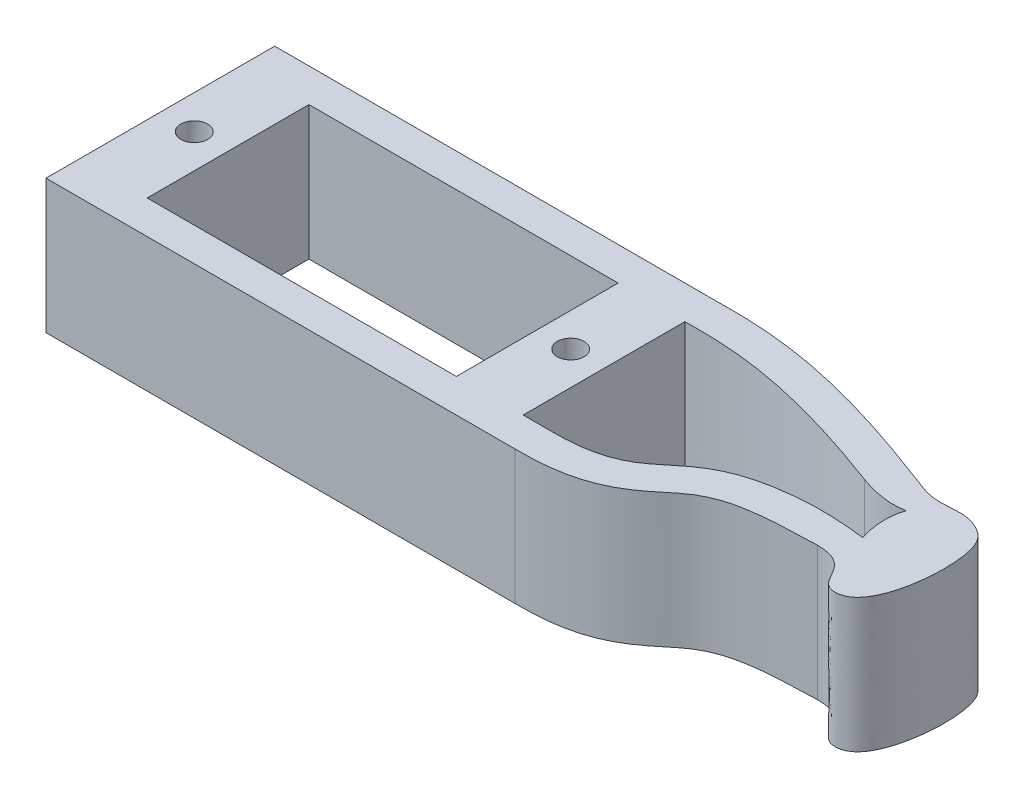
ISO-10303-21;
HEADER;
FILE_DESCRIPTION(('STEP AP214'),'2;1');
FILE_NAME('part.step','',(''),(''),'','','');
FILE_SCHEMA(('AUTOMOTIVE_DESIGN { 1 0 10303 214 1 1 1 1 }'));
ENDSEC;
DATA;
#1=APPLICATION_CONTEXT('core data for automotive mechanical design processes');
#2=APPLICATION_PROTOCOL_DEFINITION('international standard','automotive_design',2000,#1);
#3=PRODUCT_CONTEXT('',#1,'mechanical');
#4=PRODUCT('Part','Part','',(#3));
#5=PRODUCT_RELATED_PRODUCT_CATEGORY('part','',(#4));
#6=PRODUCT_DEFINITION_FORMATION('','',#4);
#7=PRODUCT_DEFINITION_CONTEXT('part definition',#1,'design');
#8=PRODUCT_DEFINITION('design','',#6,#7);
#9=PRODUCT_DEFINITION_SHAPE('','',#8);
#10=(LENGTH_UNIT() NAMED_UNIT(*) SI_UNIT(.MILLI.,.METRE.));
#11=(NAMED_UNIT(*) PLANE_ANGLE_UNIT() SI_UNIT($,.RADIAN.));
#12=(NAMED_UNIT(*) SI_UNIT($,.STERADIAN.) SOLID_ANGLE_UNIT());
#13=UNCERTAINTY_MEASURE_WITH_UNIT(LENGTH_MEASURE(1.E-05),#10,'distance_accuracy_value','');
#14=(GEOMETRIC_REPRESENTATION_CONTEXT(3) GLOBAL_UNCERTAINTY_ASSIGNED_CONTEXT((#13)) GLOBAL_UNIT_ASSIGNED_CONTEXT((#10,
#11,#12)) REPRESENTATION_CONTEXT('',''));
#15=CARTESIAN_POINT('',(0.,0.,0.));
#16=DIRECTION('',(0.,0.,1.));
#17=DIRECTION('',(1.,0.,0.));
#18=AXIS2_PLACEMENT_3D('',#15,#16,#17);
#19=CARTESIAN_POINT('',(38.8180795672071,10.,11.4476657768561));
#20=DIRECTION('',(0.,-1.,0.));
#21=DIRECTION('',(0.,0.,-1.));
#22=AXIS2_PLACEMENT_3D('',#19,#20,#21);
#23=PLANE('',#22);
#24=DIRECTION('',(-1.,0.,0.));
#25=VECTOR('',#24,1.);
#26=CARTESIAN_POINT('',(0.,10.,0.));
#27=LINE('',#26,#25);
#28=CARTESIAN_POINT('',(23.1,10.,0.));
#29=VERTEX_POINT('',#28);
#30=CARTESIAN_POINT('',(0.,10.,0.));
#31=VERTEX_POINT('',#30);
#32=EDGE_CURVE('E601',#29,#31,#27,.T.);
#33=ORIENTED_EDGE('',*,*,#32,.F.);
#34=DIRECTION('',(0.,0.,-1.));
#35=VECTOR('',#34,1.);
#36=CARTESIAN_POINT('',(23.1,10.,12.0851651354171));
#37=LINE('',#36,#35);
#38=CARTESIAN_POINT('',(23.1,10.,12.0851651354171));
#39=VERTEX_POINT('',#38);
#40=EDGE_CURVE('E612',#39,#29,#37,.T.);
#41=ORIENTED_EDGE('',*,*,#40,.F.);
#42=DIRECTION('',(1.,0.,0.));
#43=VECTOR('',#42,1.);
#44=CARTESIAN_POINT('',(0.,10.,12.0851651354171));
#45=LINE('',#44,#43);
#46=CARTESIAN_POINT('',(0.,10.,12.0851651354171));
#47=VERTEX_POINT('',#46);
#48=EDGE_CURVE('E608',#47,#39,#45,.T.);
#49=ORIENTED_EDGE('',*,*,#48,.F.);
#50=DIRECTION('',(0.,0.,1.));
#51=VECTOR('',#50,1.);
#52=CARTESIAN_POINT('',(0.,10.,0.));
#53=LINE('',#52,#51);
#54=EDGE_CURVE('E604',#31,#47,#53,.T.);
#55=ORIENTED_EDGE('',*,*,#54,.F.);
#56=EDGE_LOOP('',(#33,#41,#49,#55));
#57=FACE_BOUND('',#56,.T.);
#58=DIRECTION('',(-1.,0.,0.));
#59=VECTOR('',#58,1.);
#60=CARTESIAN_POINT('',(-2.5,10.,-2.5));
#61=LINE('',#60,#59);
#62=CARTESIAN_POINT('',(28.0710705338312,10.,-2.5));
#63=VERTEX_POINT('',#62);
#64=CARTESIAN_POINT('',(-5.06162779095857,10.,-2.5));
#65=VERTEX_POINT('',#64);
#66=EDGE_CURVE('E303',#63,#65,#61,.T.);
#67=ORIENTED_EDGE('',*,*,#66,.T.);
#68=DIRECTION('',(0.,0.,1.));
#69=VECTOR('',#68,1.);
#70=CARTESIAN_POINT('',(-5.06162779095857,10.,-2.5));
#71=LINE('',#70,#69);
#72=CARTESIAN_POINT('',(-5.06162779095857,10.,14.5851651354171));
#73=VERTEX_POINT('',#72);
#74=EDGE_CURVE('E327',#65,#73,#71,.T.);
#75=ORIENTED_EDGE('',*,*,#74,.T.);
#76=DIRECTION('',(1.,0.,0.));
#77=VECTOR('',#76,1.);
#78=CARTESIAN_POINT('',(-5.06162779095857,10.,14.5851651354171));
#79=LINE('',#78,#77);
#80=CARTESIAN_POINT('',(29.9653088290822,10.,14.5851651354171));
#81=VERTEX_POINT('',#80);
#82=EDGE_CURVE('E325',#73,#81,#79,.T.);
#83=ORIENTED_EDGE('',*,*,#82,.T.);
#84=CARTESIAN_POINT('',(29.9653088290822,10.,14.5851651354171));
#85=CARTESIAN_POINT('',(30.265918726977,10.,14.5898273179801));
#86=CARTESIAN_POINT('',(30.8820735190505,10.,14.5874895720548));
#87=CARTESIAN_POINT('',(31.9957077565243,10.,14.5340669308558));
#88=CARTESIAN_POINT('',(33.2670048927527,10.,14.3780541720264));
#89=CARTESIAN_POINT('',(34.6081596512348,10.,14.0479264842163));
#90=CARTESIAN_POINT('',(36.1765576739849,10.,13.4304805226767));
#91=CARTESIAN_POINT('',(37.6743714620708,10.,12.4202539536069));
#92=CARTESIAN_POINT('',(38.8525565692643,10.,11.3916870089746));
#93=CARTESIAN_POINT('',(39.8238796641146,10.,10.6989926716314));
#94=CARTESIAN_POINT('',(40.9308835767077,10.,10.2053361425746));
#95=CARTESIAN_POINT('',(42.3284062711518,10.,9.86988371824036));
#96=CARTESIAN_POINT('',(43.4554784758485,10.,9.71129964165567));
#97=CARTESIAN_POINT('',(44.4120672135985,10.,9.63734112365588));
#98=CARTESIAN_POINT('',(44.9894319310272,10.,9.60878294824058));
#99=CARTESIAN_POINT('',(45.9980119648731,10.,9.5722300676556));
#100=CARTESIAN_POINT('',(46.8281698923848,10.,9.53956708288117));
#101=CARTESIAN_POINT('',(47.4956003732826,10.,9.51414141536678));
#102=B_SPLINE_CURVE_WITH_KNOTS('',3,(#84,#85,#86,#87,#88,#89,#90,#91,#92,#93,#94,#95,#96,#97,
#98,#99,#100,#101),.UNSPECIFIED.,.F.,.F.,(4,1,1,1,1,1,1,1,1,1,1,1,1,1,1,4),
(0.000758631010886912,0.0345191574764747,0.0682796839420625,0.135800736873238,0.203321789804413,
0.270842842735589,0.405884948597939,0.54092705446029,0.675969160322641,0.811011266184992,
0.878532319116167,0.946053372047343,0.979813898512931,0.996694161745724,1.01357442497852,
1.08109547790969),.UNSPECIFIED.);
#103=CARTESIAN_POINT('',(47.4956003732825,10.,9.51414141536678));
#104=VERTEX_POINT('',#103);
#105=EDGE_CURVE('E347',#81,#104,#102,.T.);
#106=ORIENTED_EDGE('',*,*,#105,.T.);
#107=CARTESIAN_POINT('',(47.4956003732825,10.,9.51414141536678));
#108=CARTESIAN_POINT('',(50.1829843049378,10.,9.48052862720533));
#109=CARTESIAN_POINT('',(49.5532829579756,10.,12.1452177729383));
#110=CARTESIAN_POINT('',(53.7490053885279,10.,11.6341926827288));
#111=CARTESIAN_POINT('',(54.2885740527018,10.,3.8385013757902));
#112=CARTESIAN_POINT('',(50.7289274546855,10.,1.29908628709451));
#113=CARTESIAN_POINT('',(49.7783681591544,10.,2.70174191928724));
#114=CARTESIAN_POINT('',(47.4956003732826,10.,1.7573806933215));
#115=B_SPLINE_CURVE_WITH_KNOTS('',3,(#107,#108,#109,#110,#111,#112,#113,#114),.UNSPECIFIED.,.F.,
.F.,(4,1,1,1,1,4),(0.,0.206124452316591,0.260502327976179,0.512303597860358,0.589400880936293,
1.),.UNSPECIFIED.);
#116=CARTESIAN_POINT('',(47.4956003732826,10.,1.7573806933215));
#117=VERTEX_POINT('',#116);
#118=EDGE_CURVE('E260',#104,#117,#115,.T.);
#119=ORIENTED_EDGE('',*,*,#118,.T.);
#120=CARTESIAN_POINT('',(47.4956003732826,10.,1.7573806933215));
#121=CARTESIAN_POINT('',(46.325704030634,10.,1.31962826614976));
#122=CARTESIAN_POINT('',(43.8950497031658,10.,0.404736284182584));
#123=CARTESIAN_POINT('',(40.7526738149611,10.,-0.61929276858225));
#124=CARTESIAN_POINT('',(37.9742589079886,10.,-1.38863344719493));
#125=CARTESIAN_POINT('',(34.7092860581728,10.,-2.10364630059871));
#126=CARTESIAN_POINT('',(31.9844337731172,10.,-2.42933803906978));
#127=CARTESIAN_POINT('',(29.9391455938386,10.,-2.50469427808166));
#128=CARTESIAN_POINT('',(28.8455167678502,10.,-2.51018952961797));
#129=CARTESIAN_POINT('',(28.3319692226393,10.,-2.50433770622464));
#130=CARTESIAN_POINT('',(28.0710705338312,10.,-2.5));
#131=B_SPLINE_CURVE_WITH_KNOTS('',3,(#120,#121,#122,#123,#124,#125,#126,#127,#128,#129,#130),
.UNSPECIFIED.,.F.,.F.,(4,1,1,1,1,1,1,1,4),(0.143652209632504,0.257209336272867,
0.370766462913229,0.484323589553591,0.597880716193954,0.824994969474678,0.938552096115041,
0.995330659435222,1.0521092227554),.UNSPECIFIED.);
#132=EDGE_CURVE('E252',#117,#63,#131,.T.);
#133=ORIENTED_EDGE('',*,*,#132,.T.);
#134=EDGE_LOOP('',(#67,#75,#83,#106,#119,#133));
#135=FACE_BOUND('',#134,.T.);
#136=CARTESIAN_POINT('',(29.9852161632243,10.,12.0851651354171));
#137=CARTESIAN_POINT('',(38.2810747079521,10.,12.2209443605822));
#138=CARTESIAN_POINT('',(35.1108244119517,10.,7.48412429725424));
#139=CARTESIAN_POINT('',(44.9956003732826,10.,7.10756518849293));
#140=B_SPLINE_CURVE_WITH_KNOTS('',3,(#136,#137,#138,#139),.UNSPECIFIED.,.F.,.F.,(4,4),(0.,1.),.UNSPECIFIED.);
#141=CARTESIAN_POINT('',(29.9852161632243,10.,12.0851651354171));
#142=VERTEX_POINT('',#141);
#143=CARTESIAN_POINT('',(44.9956003732826,10.,7.10756518849293));
#144=VERTEX_POINT('',#143);
#145=EDGE_CURVE('E165',#142,#144,#140,.T.);
#146=ORIENTED_EDGE('',*,*,#145,.F.);
#147=DIRECTION('',(1.,0.,0.));
#148=VECTOR('',#147,1.);
#149=CARTESIAN_POINT('',(28.0920322760738,10.,12.0851651354171));
#150=LINE('',#149,#148);
#151=CARTESIAN_POINT('',(28.0920322760738,10.,12.0851651354171));
#152=VERTEX_POINT('',#151);
#153=EDGE_CURVE('E534',#152,#142,#150,.T.);
#154=ORIENTED_EDGE('',*,*,#153,.F.);
#155=DIRECTION('',(0.,0.,1.));
#156=VECTOR('',#155,1.);
#157=CARTESIAN_POINT('',(28.0920322760738,10.,0.));
#158=LINE('',#157,#156);
#159=CARTESIAN_POINT('',(28.0920322760738,10.,0.));
#160=VERTEX_POINT('',#159);
#161=EDGE_CURVE('E525',#160,#152,#158,.T.);
#162=ORIENTED_EDGE('',*,*,#161,.F.);
#163=CARTESIAN_POINT('',(44.9956003732826,10.,3.49121189900544));
#164=CARTESIAN_POINT('',(36.0837642694881,10.,0.156576390905116));
#165=CARTESIAN_POINT('',(31.8190342239397,10.,-0.0630491739583388));
#166=CARTESIAN_POINT('',(28.0920322760738,10.,0.));
#167=B_SPLINE_CURVE_WITH_KNOTS('',3,(#163,#164,#165,#166),.UNSPECIFIED.,.F.,.F.,(4,4),
(0.142072163734168,1.),.UNSPECIFIED.);
#168=CARTESIAN_POINT('',(44.9956003732826,10.,3.49121189900544));
#169=VERTEX_POINT('',#168);
#170=EDGE_CURVE('E519',#169,#160,#167,.T.);
#171=ORIENTED_EDGE('',*,*,#170,.F.);
#172=CARTESIAN_POINT('',(48.5973126252053,10.,3.96311649777559));
#173=CARTESIAN_POINT('',(47.1194473607959,10.,4.2650860076599));
#174=CARTESIAN_POINT('',(44.9956003732826,10.,3.49121189900543));
#175=B_SPLINE_CURVE_WITH_KNOTS('',2,(#172,#173,#174),.UNSPECIFIED.,.F.,.F.,(3,3),(0.,1.),.UNSPECIFIED.);
#176=CARTESIAN_POINT('',(48.5973126252053,10.,3.96311649777559));
#177=VERTEX_POINT('',#176);
#178=EDGE_CURVE('E193',#177,#169,#175,.T.);
#179=ORIENTED_EDGE('',*,*,#178,.F.);
#180=CARTESIAN_POINT('',(48.7103270151303,10.,7.32576645158645));
#181=CARTESIAN_POINT('',(48.3452536132831,10.,6.19757171358135));
#182=CARTESIAN_POINT('',(48.2430866216302,10.,5.00954180630637));
#183=CARTESIAN_POINT('',(48.5973126252053,10.,3.96311649777559));
#184=B_SPLINE_CURVE_WITH_KNOTS('',3,(#180,#181,#182,#183),.UNSPECIFIED.,.F.,.F.,(4,4),(0.,1.),.UNSPECIFIED.);
#185=CARTESIAN_POINT('',(48.7103270151303,10.,7.32576645158645));
#186=VERTEX_POINT('',#185);
#187=EDGE_CURVE('E189',#186,#177,#184,.T.);
#188=ORIENTED_EDGE('',*,*,#187,.F.);
#189=CARTESIAN_POINT('',(44.9956003732826,10.,7.10756518849293));
#190=CARTESIAN_POINT('',(46.5345408888566,10.,7.08391660517014));
#191=CARTESIAN_POINT('',(48.7103270151303,10.,7.32576645158645));
#192=B_SPLINE_CURVE_WITH_KNOTS('',2,(#189,#190,#191),.UNSPECIFIED.,.F.,.F.,(3,3),(0.,1.),.UNSPECIFIED.);
#193=EDGE_CURVE('E174',#144,#186,#192,.T.);
#194=ORIENTED_EDGE('',*,*,#193,.F.);
#195=EDGE_LOOP('',(#146,#154,#162,#171,#179,#188,#194));
#196=FACE_BOUND('',#195,.T.);
#197=CARTESIAN_POINT('',(-2.53081389547928,10.,6.04258256770856));
#198=DIRECTION('',(0.,1.,0.));
#199=DIRECTION('',(0.,0.,1.));
#200=AXIS2_PLACEMENT_3D('',#197,#198,#199);
#201=CIRCLE('',#200,1.);
#202=CARTESIAN_POINT('',(-2.53081389547928,10.,7.04258256770856));
#203=VERTEX_POINT('',#202);
#204=EDGE_CURVE('E541',#203,#203,#201,.T.);
#205=ORIENTED_EDGE('',*,*,#204,.F.);
#206=EDGE_LOOP('',(#205));
#207=FACE_BOUND('',#206,.T.);
#208=CARTESIAN_POINT('',(25.6000010172625,10.,6.04254892676587));
#209=DIRECTION('',(0.,1.,0.));
#210=DIRECTION('',(0.,0.,1.));
#211=AXIS2_PLACEMENT_3D('',#208,#209,#210);
#212=CIRCLE('',#211,1.);
#213=CARTESIAN_POINT('',(25.6000010172625,10.,7.04254892676587));
#214=VERTEX_POINT('',#213);
#215=EDGE_CURVE('E661',#214,#214,#212,.T.);
#216=ORIENTED_EDGE('',*,*,#215,.F.);
#217=EDGE_LOOP('',(#216));
#218=FACE_BOUND('',#217,.T.);
#219=ADVANCED_FACE('F45',(#57,#135,#196,#207,#218),#23,.F.);
#220=CARTESIAN_POINT('',(38.8180795672071,0.,11.4476657768561));
#221=DIRECTION('',(0.,-1.,0.));
#222=DIRECTION('',(0.,0.,-1.));
#223=AXIS2_PLACEMENT_3D('',#220,#221,#222);
#224=PLANE('',#223);
#225=CARTESIAN_POINT('',(-2.53081389547928,0.,6.04258256770856));
#226=DIRECTION('',(0.,1.,0.));
#227=DIRECTION('',(0.,0.,1.));
#228=AXIS2_PLACEMENT_3D('',#225,#226,#227);
#229=CIRCLE('',#228,1.);
#230=CARTESIAN_POINT('',(-2.53081389547928,0.,7.04258256770856));
#231=VERTEX_POINT('',#230);
#232=EDGE_CURVE('E664',#231,#231,#229,.T.);
#233=ORIENTED_EDGE('',*,*,#232,.T.);
#234=EDGE_LOOP('',(#233));
#235=FACE_BOUND('',#234,.T.);
#236=DIRECTION('',(0.,0.,1.));
#237=VECTOR('',#236,1.);
#238=CARTESIAN_POINT('',(-5.06162779095857,0.,-2.5));
#239=LINE('',#238,#237);
#240=CARTESIAN_POINT('',(-5.06162779095857,0.,-2.5));
#241=VERTEX_POINT('',#240);
#242=CARTESIAN_POINT('',(-5.06162779095857,0.,14.5851651354171));
#243=VERTEX_POINT('',#242);
#244=EDGE_CURVE('E265',#241,#243,#239,.T.);
#245=ORIENTED_EDGE('',*,*,#244,.F.);
#246=DIRECTION('',(-1.,0.,0.));
#247=VECTOR('',#246,1.);
#248=CARTESIAN_POINT('',(-2.5,0.,-2.5));
#249=LINE('',#248,#247);
#250=CARTESIAN_POINT('',(28.0710705338312,0.,-2.5));
#251=VERTEX_POINT('',#250);
#252=EDGE_CURVE('E297',#251,#241,#249,.T.);
#253=ORIENTED_EDGE('',*,*,#252,.F.);
#254=CARTESIAN_POINT('',(47.4956003732826,0.,1.7573806933215));
#255=CARTESIAN_POINT('',(46.325704030634,0.,1.31962826614976));
#256=CARTESIAN_POINT('',(43.8950497031658,0.,0.404736284182584));
#257=CARTESIAN_POINT('',(40.7526738149611,0.,-0.61929276858225));
#258=CARTESIAN_POINT('',(37.9742589079886,0.,-1.38863344719493));
#259=CARTESIAN_POINT('',(34.7092860581728,0.,-2.10364630059871));
#260=CARTESIAN_POINT('',(31.9844337731172,0.,-2.42933803906978));
#261=CARTESIAN_POINT('',(29.9391455938386,0.,-2.50469427808166));
#262=CARTESIAN_POINT('',(28.8455167678502,0.,-2.51018952961797));
#263=CARTESIAN_POINT('',(28.3319692226393,0.,-2.50433770622464));
#264=CARTESIAN_POINT('',(28.0710705338312,0.,-2.5));
#265=B_SPLINE_CURVE_WITH_KNOTS('',3,(#254,#255,#256,#257,#258,#259,#260,#261,#262,#263,#264),
.UNSPECIFIED.,.F.,.F.,(4,1,1,1,1,1,1,1,4),(0.143652209632504,0.257209336272867,
0.370766462913229,0.484323589553591,0.597880716193954,0.824994969474678,0.938552096115041,
0.995330659435222,1.0521092227554),.UNSPECIFIED.);
#266=CARTESIAN_POINT('',(47.4956003732826,0.,1.7573806933215));
#267=VERTEX_POINT('',#266);
#268=EDGE_CURVE('E289',#267,#251,#265,.T.);
#269=ORIENTED_EDGE('',*,*,#268,.F.);
#270=CARTESIAN_POINT('',(47.4956003732825,0.,9.51414141536678));
#271=CARTESIAN_POINT('',(50.1829843049378,0.,9.48052862720533));
#272=CARTESIAN_POINT('',(49.5532829579756,0.,12.1452177729383));
#273=CARTESIAN_POINT('',(53.7490053885279,0.,11.6341926827288));
#274=CARTESIAN_POINT('',(54.2885740527018,0.,3.8385013757902));
#275=CARTESIAN_POINT('',(50.7289274546855,0.,1.29908628709451));
#276=CARTESIAN_POINT('',(49.7783681591544,0.,2.70174191928724));
#277=CARTESIAN_POINT('',(47.4956003732826,0.,1.7573806933215));
#278=B_SPLINE_CURVE_WITH_KNOTS('',3,(#270,#271,#272,#273,#274,#275,#276,#277),.UNSPECIFIED.,.F.,
.F.,(4,1,1,1,1,4),(0.,0.206124452316591,0.260502327976179,0.512303597860358,0.589400880936293,
1.),.UNSPECIFIED.);
#279=CARTESIAN_POINT('',(47.4956003732825,0.,9.51414141536678));
#280=VERTEX_POINT('',#279);
#281=EDGE_CURVE('E281',#280,#267,#278,.T.);
#282=ORIENTED_EDGE('',*,*,#281,.F.);
#283=CARTESIAN_POINT('',(29.9653088290822,0.,14.5851651354171));
#284=CARTESIAN_POINT('',(30.265918726977,0.,14.5898273179801));
#285=CARTESIAN_POINT('',(30.8820735190505,0.,14.5874895720548));
#286=CARTESIAN_POINT('',(31.9957077565243,0.,14.5340669308558));
#287=CARTESIAN_POINT('',(33.2670048927527,0.,14.3780541720264));
#288=CARTESIAN_POINT('',(34.6081596512348,0.,14.0479264842163));
#289=CARTESIAN_POINT('',(36.1765576739849,0.,13.4304805226767));
#290=CARTESIAN_POINT('',(37.6743714620708,0.,12.4202539536069));
#291=CARTESIAN_POINT('',(38.8525565692643,0.,11.3916870089746));
#292=CARTESIAN_POINT('',(39.8238796641146,0.,10.6989926716314));
#293=CARTESIAN_POINT('',(40.9308835767077,0.,10.2053361425746));
#294=CARTESIAN_POINT('',(42.3284062711518,0.,9.86988371824036));
#295=CARTESIAN_POINT('',(43.4554784758485,0.,9.71129964165567));
#296=CARTESIAN_POINT('',(44.4120672135985,0.,9.63734112365588));
#297=CARTESIAN_POINT('',(44.9894319310272,0.,9.60878294824058));
#298=CARTESIAN_POINT('',(45.9980119648731,0.,9.5722300676556));
#299=CARTESIAN_POINT('',(46.8281698923848,0.,9.53956708288117));
#300=CARTESIAN_POINT('',(47.4956003732826,0.,9.51414141536678));
#301=B_SPLINE_CURVE_WITH_KNOTS('',3,(#283,#284,#285,#286,#287,#288,#289,#290,#291,#292,#293,
#294,#295,#296,#297,#298,#299,#300),.UNSPECIFIED.,.F.,.F.,(4,1,1,1,1,1,1,1,1,1,1,1,1,1,1,4),
(0.000758631010886912,0.0345191574764747,0.0682796839420625,0.135800736873238,0.203321789804413,
0.270842842735589,0.405884948597939,0.54092705446029,0.675969160322641,0.811011266184992,
0.878532319116167,0.946053372047343,0.979813898512931,0.996694161745724,1.01357442497852,
1.08109547790969),.UNSPECIFIED.);
#302=CARTESIAN_POINT('',(29.9653088290822,0.,14.5851651354171));
#303=VERTEX_POINT('',#302);
#304=EDGE_CURVE('E276',#303,#280,#301,.T.);
#305=ORIENTED_EDGE('',*,*,#304,.F.);
#306=DIRECTION('',(1.,0.,0.));
#307=VECTOR('',#306,1.);
#308=CARTESIAN_POINT('',(-2.5,0.,14.5851651354171));
#309=LINE('',#308,#307);
#310=EDGE_CURVE('E272',#243,#303,#309,.T.);
#311=ORIENTED_EDGE('',*,*,#310,.F.);
#312=EDGE_LOOP('',(#245,#253,#269,#282,#305,#311));
#313=FACE_BOUND('',#312,.T.);
#314=DIRECTION('',(0.,0.,-1.));
#315=VECTOR('',#314,1.);
#316=CARTESIAN_POINT('',(23.1,0.,12.0851651354171));
#317=LINE('',#316,#315);
#318=CARTESIAN_POINT('',(23.1,0.,12.0851651354171));
#319=VERTEX_POINT('',#318);
#320=CARTESIAN_POINT('',(23.1,0.,0.));
#321=VERTEX_POINT('',#320);
#322=EDGE_CURVE('E605',#319,#321,#317,.T.);
#323=ORIENTED_EDGE('',*,*,#322,.T.);
#324=DIRECTION('',(-1.,0.,0.));
#325=VECTOR('',#324,1.);
#326=CARTESIAN_POINT('',(0.,0.,0.));
#327=LINE('',#326,#325);
#328=CARTESIAN_POINT('',(0.,0.,0.));
#329=VERTEX_POINT('',#328);
#330=EDGE_CURVE('E183',#321,#329,#327,.T.);
#331=ORIENTED_EDGE('',*,*,#330,.T.);
#332=DIRECTION('',(0.,0.,1.));
#333=VECTOR('',#332,1.);
#334=CARTESIAN_POINT('',(0.,0.,0.));
#335=LINE('',#334,#333);
#336=CARTESIAN_POINT('',(0.,0.,12.0851651354171));
#337=VERTEX_POINT('',#336);
#338=EDGE_CURVE('E619',#329,#337,#335,.T.);
#339=ORIENTED_EDGE('',*,*,#338,.T.);
#340=DIRECTION('',(1.,0.,0.));
#341=VECTOR('',#340,1.);
#342=CARTESIAN_POINT('',(0.,0.,12.0851651354171));
#343=LINE('',#342,#341);
#344=EDGE_CURVE('E623',#337,#319,#343,.T.);
#345=ORIENTED_EDGE('',*,*,#344,.T.);
#346=EDGE_LOOP('',(#323,#331,#339,#345));
#347=FACE_BOUND('',#346,.T.);
#348=DIRECTION('',(1.,0.,0.));
#349=VECTOR('',#348,1.);
#350=CARTESIAN_POINT('',(28.0920322760738,0.,12.0851651354171));
#351=LINE('',#350,#349);
#352=CARTESIAN_POINT('',(28.0920322760738,0.,12.0851651354171));
#353=VERTEX_POINT('',#352);
#354=CARTESIAN_POINT('',(29.9852161632243,0.,12.0851651354171));
#355=VERTEX_POINT('',#354);
#356=EDGE_CURVE('E175',#353,#355,#351,.T.);
#357=ORIENTED_EDGE('',*,*,#356,.T.);
#358=CARTESIAN_POINT('',(29.9852161632243,0.,12.0851651354171));
#359=CARTESIAN_POINT('',(38.2810747079521,0.,12.2209443605822));
#360=CARTESIAN_POINT('',(35.1108244119517,0.,7.48412429725424));
#361=CARTESIAN_POINT('',(44.9956003732826,0.,7.10756518849293));
#362=B_SPLINE_CURVE_WITH_KNOTS('',3,(#358,#359,#360,#361),.UNSPECIFIED.,.F.,.F.,(4,4),(0.,1.),.UNSPECIFIED.);
#363=CARTESIAN_POINT('',(44.9956003732826,0.,7.10756518849293));
#364=VERTEX_POINT('',#363);
#365=EDGE_CURVE('E69',#355,#364,#362,.T.);
#366=ORIENTED_EDGE('',*,*,#365,.T.);
#367=CARTESIAN_POINT('',(44.9956003732826,0.,7.10756518849293));
#368=CARTESIAN_POINT('',(46.5345408888566,0.,7.08391660517014));
#369=CARTESIAN_POINT('',(48.7103270151303,0.,7.32576645158645));
#370=B_SPLINE_CURVE_WITH_KNOTS('',2,(#367,#368,#369),.UNSPECIFIED.,.F.,.F.,(3,3),(0.,1.),.UNSPECIFIED.);
#371=CARTESIAN_POINT('',(48.7103270151303,0.,7.32576645158645));
#372=VERTEX_POINT('',#371);
#373=EDGE_CURVE('E181',#364,#372,#370,.T.);
#374=ORIENTED_EDGE('',*,*,#373,.T.);
#375=CARTESIAN_POINT('',(48.7103270151303,0.,7.32576645158645));
#376=CARTESIAN_POINT('',(48.3452536132831,0.,6.19757171358135));
#377=CARTESIAN_POINT('',(48.2430866216302,0.,5.00954180630637));
#378=CARTESIAN_POINT('',(48.5973126252053,0.,3.96311649777559));
#379=B_SPLINE_CURVE_WITH_KNOTS('',3,(#375,#376,#377,#378),.UNSPECIFIED.,.F.,.F.,(4,4),(0.,1.),.UNSPECIFIED.);
#380=CARTESIAN_POINT('',(48.5973126252053,0.,3.96311649777559));
#381=VERTEX_POINT('',#380);
#382=EDGE_CURVE('E549',#372,#381,#379,.T.);
#383=ORIENTED_EDGE('',*,*,#382,.T.);
#384=CARTESIAN_POINT('',(48.5973126252053,0.,3.96311649777559));
#385=CARTESIAN_POINT('',(47.1194473607959,0.,4.2650860076599));
#386=CARTESIAN_POINT('',(44.9956003732826,0.,3.49121189900543));
#387=B_SPLINE_CURVE_WITH_KNOTS('',2,(#384,#385,#386),.UNSPECIFIED.,.F.,.F.,(3,3),(0.,1.),.UNSPECIFIED.);
#388=CARTESIAN_POINT('',(44.9956003732826,0.,3.49121189900544));
#389=VERTEX_POINT('',#388);
#390=EDGE_CURVE('E558',#381,#389,#387,.T.);
#391=ORIENTED_EDGE('',*,*,#390,.T.);
#392=CARTESIAN_POINT('',(44.9956003732826,0.,3.49121189900544));
#393=CARTESIAN_POINT('',(36.0837642694881,0.,0.156576390905116));
#394=CARTESIAN_POINT('',(31.8190342239397,0.,-0.0630491739583388));
#395=CARTESIAN_POINT('',(28.0920322760738,0.,0.));
#396=B_SPLINE_CURVE_WITH_KNOTS('',3,(#392,#393,#394,#395),.UNSPECIFIED.,.F.,.F.,(4,4),
(0.142072163734168,1.),.UNSPECIFIED.);
#397=CARTESIAN_POINT('',(28.0920322760738,0.,0.));
#398=VERTEX_POINT('',#397);
#399=EDGE_CURVE('E567',#389,#398,#396,.T.);
#400=ORIENTED_EDGE('',*,*,#399,.T.);
#401=DIRECTION('',(0.,0.,1.));
#402=VECTOR('',#401,1.);
#403=CARTESIAN_POINT('',(28.0920322760738,0.,0.));
#404=LINE('',#403,#402);
#405=EDGE_CURVE('E576',#398,#353,#404,.T.);
#406=ORIENTED_EDGE('',*,*,#405,.T.);
#407=EDGE_LOOP('',(#357,#366,#374,#383,#391,#400,#406));
#408=FACE_BOUND('',#407,.T.);
#409=CARTESIAN_POINT('',(25.6000010172625,0.,6.04254892676587));
#410=DIRECTION('',(0.,1.,0.));
#411=DIRECTION('',(0.,0.,1.));
#412=AXIS2_PLACEMENT_3D('',#409,#410,#411);
#413=CIRCLE('',#412,1.);
#414=CARTESIAN_POINT('',(25.6000010172625,0.,7.04254892676587));
#415=VERTEX_POINT('',#414);
#416=EDGE_CURVE('E659',#415,#415,#413,.T.);
#417=ORIENTED_EDGE('',*,*,#416,.T.);
#418=EDGE_LOOP('',(#417));
#419=FACE_BOUND('',#418,.T.);
#420=ADVANCED_FACE('F236',(#235,#313,#347,#408,#419),#224,.T.);
#421=CARTESIAN_POINT('',(-5.06162779095857,10.,-2.5));
#422=DIRECTION('',(1.,0.,0.));
#423=DIRECTION('',(0.,0.,-1.));
#424=AXIS2_PLACEMENT_3D('',#421,#422,#423);
#425=PLANE('',#424);
#426=ORIENTED_EDGE('',*,*,#244,.T.);
#427=DIRECTION('',(0.,-1.,0.));
#428=VECTOR('',#427,1.);
#429=CARTESIAN_POINT('',(-5.06162779095857,10.,14.5851651354171));
#430=LINE('',#429,#428);
#431=EDGE_CURVE('E54',#73,#243,#430,.T.);
#432=ORIENTED_EDGE('',*,*,#431,.F.);
#433=ORIENTED_EDGE('',*,*,#74,.F.);
#434=DIRECTION('',(0.,-1.,0.));
#435=VECTOR('',#434,1.);
#436=CARTESIAN_POINT('',(-5.06162779095857,10.,-2.5));
#437=LINE('',#436,#435);
#438=EDGE_CURVE('E11',#65,#241,#437,.T.);
#439=ORIENTED_EDGE('',*,*,#438,.T.);
#440=EDGE_LOOP('',(#426,#432,#433,#439));
#441=FACE_BOUND('',#440,.T.);
#442=ADVANCED_FACE('F47',(#441),#425,.F.);
#443=CARTESIAN_POINT('',(-2.5,10.,14.5851651354171));
#444=DIRECTION('',(0.,0.,-1.));
#445=DIRECTION('',(-1.,0.,0.));
#446=AXIS2_PLACEMENT_3D('',#443,#444,#445);
#447=PLANE('',#446);
#448=ORIENTED_EDGE('',*,*,#310,.T.);
#449=DIRECTION('',(0.,-1.,0.));
#450=VECTOR('',#449,1.);
#451=CARTESIAN_POINT('',(29.9653088290822,10.,14.5851651354171));
#452=LINE('',#451,#450);
#453=EDGE_CURVE('E315',#81,#303,#452,.T.);
#454=ORIENTED_EDGE('',*,*,#453,.F.);
#455=ORIENTED_EDGE('',*,*,#82,.F.);
#456=ORIENTED_EDGE('',*,*,#431,.T.);
#457=EDGE_LOOP('',(#448,#454,#455,#456));
#458=FACE_BOUND('',#457,.T.);
#459=ADVANCED_FACE('F323',(#458),#447,.F.);
#460=DIRECTION('',(0.,-1.,0.));
#461=VECTOR('',#460,1.);
#462=SURFACE_OF_LINEAR_EXTRUSION('',#102,#461);
#463=ORIENTED_EDGE('',*,*,#304,.T.);
#464=DIRECTION('',(0.,-1.,0.));
#465=VECTOR('',#464,1.);
#466=CARTESIAN_POINT('',(47.4956003732825,10.,9.51414141536678));
#467=LINE('',#466,#465);
#468=EDGE_CURVE('E311',#104,#280,#467,.T.);
#469=ORIENTED_EDGE('',*,*,#468,.F.);
#470=ORIENTED_EDGE('',*,*,#105,.F.);
#471=ORIENTED_EDGE('',*,*,#453,.T.);
#472=EDGE_LOOP('',(#463,#469,#470,#471));
#473=FACE_BOUND('',#472,.T.);
#474=ADVANCED_FACE('F339',(#473),#462,.F.);
#475=DIRECTION('',(0.,-1.,0.));
#476=VECTOR('',#475,1.);
#477=SURFACE_OF_LINEAR_EXTRUSION('',#115,#476);
#478=ORIENTED_EDGE('',*,*,#281,.T.);
#479=DIRECTION('',(0.,-1.,0.));
#480=VECTOR('',#479,1.);
#481=CARTESIAN_POINT('',(47.4956003732826,10.,1.7573806933215));
#482=LINE('',#481,#480);
#483=EDGE_CURVE('E307',#117,#267,#482,.T.);
#484=ORIENTED_EDGE('',*,*,#483,.F.);
#485=ORIENTED_EDGE('',*,*,#118,.F.);
#486=ORIENTED_EDGE('',*,*,#468,.T.);
#487=EDGE_LOOP('',(#478,#484,#485,#486));
#488=FACE_BOUND('',#487,.T.);
#489=ADVANCED_FACE('F248',(#488),#477,.F.);
#490=DIRECTION('',(0.,-1.,0.));
#491=VECTOR('',#490,1.);
#492=SURFACE_OF_LINEAR_EXTRUSION('',#131,#491);
#493=ORIENTED_EDGE('',*,*,#268,.T.);
#494=DIRECTION('',(0.,-1.,0.));
#495=VECTOR('',#494,1.);
#496=CARTESIAN_POINT('',(28.0710705338312,10.,-2.5));
#497=LINE('',#496,#495);
#498=EDGE_CURVE('E259',#63,#251,#497,.T.);
#499=ORIENTED_EDGE('',*,*,#498,.F.);
#500=ORIENTED_EDGE('',*,*,#132,.F.);
#501=ORIENTED_EDGE('',*,*,#483,.T.);
#502=EDGE_LOOP('',(#493,#499,#500,#501));
#503=FACE_BOUND('',#502,.T.);
#504=ADVANCED_FACE('F243',(#503),#492,.F.);
#505=CARTESIAN_POINT('',(-2.5,10.,-2.5));
#506=DIRECTION('',(0.,0.,1.));
#507=DIRECTION('',(1.,0.,0.));
#508=AXIS2_PLACEMENT_3D('',#505,#506,#507);
#509=PLANE('',#508);
#510=ORIENTED_EDGE('',*,*,#252,.T.);
#511=ORIENTED_EDGE('',*,*,#438,.F.);
#512=ORIENTED_EDGE('',*,*,#66,.F.);
#513=ORIENTED_EDGE('',*,*,#498,.T.);
#514=EDGE_LOOP('',(#510,#511,#512,#513));
#515=FACE_BOUND('',#514,.T.);
#516=ADVANCED_FACE('F232',(#515),#509,.F.);
#517=CARTESIAN_POINT('',(0.,10.,0.));
#518=DIRECTION('',(0.,0.,1.));
#519=DIRECTION('',(1.,0.,0.));
#520=AXIS2_PLACEMENT_3D('',#517,#518,#519);
#521=PLANE('',#520);
#522=ORIENTED_EDGE('',*,*,#330,.F.);
#523=DIRECTION('',(0.,-1.,0.));
#524=VECTOR('',#523,1.);
#525=CARTESIAN_POINT('',(23.1,10.,0.));
#526=LINE('',#525,#524);
#527=EDGE_CURVE('E615',#29,#321,#526,.T.);
#528=ORIENTED_EDGE('',*,*,#527,.F.);
#529=ORIENTED_EDGE('',*,*,#32,.T.);
#530=DIRECTION('',(0.,-1.,0.));
#531=VECTOR('',#530,1.);
#532=CARTESIAN_POINT('',(0.,10.,0.));
#533=LINE('',#532,#531);
#534=EDGE_CURVE('E273',#31,#329,#533,.T.);
#535=ORIENTED_EDGE('',*,*,#534,.T.);
#536=EDGE_LOOP('',(#522,#528,#529,#535));
#537=FACE_BOUND('',#536,.T.);
#538=ADVANCED_FACE('F228',(#537),#521,.T.);
#539=CARTESIAN_POINT('',(0.,10.,0.));
#540=DIRECTION('',(1.,0.,0.));
#541=DIRECTION('',(0.,0.,-1.));
#542=AXIS2_PLACEMENT_3D('',#539,#540,#541);
#543=PLANE('',#542);
#544=ORIENTED_EDGE('',*,*,#338,.F.);
#545=ORIENTED_EDGE('',*,*,#534,.F.);
#546=ORIENTED_EDGE('',*,*,#54,.T.);
#547=DIRECTION('',(0.,-1.,0.));
#548=VECTOR('',#547,1.);
#549=CARTESIAN_POINT('',(0.,10.,12.0851651354171));
#550=LINE('',#549,#548);
#551=EDGE_CURVE('E636',#47,#337,#550,.T.);
#552=ORIENTED_EDGE('',*,*,#551,.T.);
#553=EDGE_LOOP('',(#544,#545,#546,#552));
#554=FACE_BOUND('',#553,.T.);
#555=ADVANCED_FACE('F224',(#554),#543,.T.);
#556=CARTESIAN_POINT('',(0.,10.,12.0851651354171));
#557=DIRECTION('',(0.,0.,-1.));
#558=DIRECTION('',(-1.,0.,0.));
#559=AXIS2_PLACEMENT_3D('',#556,#557,#558);
#560=PLANE('',#559);
#561=ORIENTED_EDGE('',*,*,#344,.F.);
#562=ORIENTED_EDGE('',*,*,#551,.F.);
#563=ORIENTED_EDGE('',*,*,#48,.T.);
#564=DIRECTION('',(0.,-1.,0.));
#565=VECTOR('',#564,1.);
#566=CARTESIAN_POINT('',(23.1,10.,12.0851651354171));
#567=LINE('',#566,#565);
#568=EDGE_CURVE('E633',#39,#319,#567,.T.);
#569=ORIENTED_EDGE('',*,*,#568,.T.);
#570=EDGE_LOOP('',(#561,#562,#563,#569));
#571=FACE_BOUND('',#570,.T.);
#572=ADVANCED_FACE('F220',(#571),#560,.T.);
#573=CARTESIAN_POINT('',(23.1,10.,12.0851651354171));
#574=DIRECTION('',(-1.,0.,0.));
#575=DIRECTION('',(0.,0.,1.));
#576=AXIS2_PLACEMENT_3D('',#573,#574,#575);
#577=PLANE('',#576);
#578=ORIENTED_EDGE('',*,*,#322,.F.);
#579=ORIENTED_EDGE('',*,*,#568,.F.);
#580=ORIENTED_EDGE('',*,*,#40,.T.);
#581=ORIENTED_EDGE('',*,*,#527,.T.);
#582=EDGE_LOOP('',(#578,#579,#580,#581));
#583=FACE_BOUND('',#582,.T.);
#584=ADVANCED_FACE('F217',(#583),#577,.T.);
#585=DIRECTION('',(0.,-1.,0.));
#586=VECTOR('',#585,1.);
#587=SURFACE_OF_LINEAR_EXTRUSION('',#140,#586);
#588=ORIENTED_EDGE('',*,*,#365,.F.);
#589=DIRECTION('',(0.,-1.,0.));
#590=VECTOR('',#589,1.);
#591=CARTESIAN_POINT('',(29.9852161632243,10.,12.0851651354171));
#592=LINE('',#591,#590);
#593=EDGE_CURVE('E169',#142,#355,#592,.T.);
#594=ORIENTED_EDGE('',*,*,#593,.F.);
#595=ORIENTED_EDGE('',*,*,#145,.T.);
#596=DIRECTION('',(0.,-1.,0.));
#597=VECTOR('',#596,1.);
#598=CARTESIAN_POINT('',(44.9956003732826,10.,7.10756518849293));
#599=LINE('',#598,#597);
#600=EDGE_CURVE('E168',#144,#364,#599,.T.);
#601=ORIENTED_EDGE('',*,*,#600,.T.);
#602=EDGE_LOOP('',(#588,#594,#595,#601));
#603=FACE_BOUND('',#602,.T.);
#604=ADVANCED_FACE('F167',(#603),#587,.T.);
#605=DIRECTION('',(0.,-1.,0.));
#606=VECTOR('',#605,1.);
#607=SURFACE_OF_LINEAR_EXTRUSION('',#192,#606);
#608=ORIENTED_EDGE('',*,*,#373,.F.);
#609=ORIENTED_EDGE('',*,*,#600,.F.);
#610=ORIENTED_EDGE('',*,*,#193,.T.);
#611=DIRECTION('',(0.,-1.,0.));
#612=VECTOR('',#611,1.);
#613=CARTESIAN_POINT('',(48.7103270151303,10.,7.32576645158645));
#614=LINE('',#613,#612);
#615=EDGE_CURVE('E184',#186,#372,#614,.T.);
#616=ORIENTED_EDGE('',*,*,#615,.T.);
#617=EDGE_LOOP('',(#608,#609,#610,#616));
#618=FACE_BOUND('',#617,.T.);
#619=ADVANCED_FACE('F178',(#618),#607,.T.);
#620=DIRECTION('',(0.,-1.,0.));
#621=VECTOR('',#620,1.);
#622=SURFACE_OF_LINEAR_EXTRUSION('',#184,#621);
#623=ORIENTED_EDGE('',*,*,#382,.F.);
#624=ORIENTED_EDGE('',*,*,#615,.F.);
#625=ORIENTED_EDGE('',*,*,#187,.T.);
#626=DIRECTION('',(0.,-1.,0.));
#627=VECTOR('',#626,1.);
#628=CARTESIAN_POINT('',(48.5973126252053,10.,3.96311649777559));
#629=LINE('',#628,#627);
#630=EDGE_CURVE('E596',#177,#381,#629,.T.);
#631=ORIENTED_EDGE('',*,*,#630,.T.);
#632=EDGE_LOOP('',(#623,#624,#625,#631));
#633=FACE_BOUND('',#632,.T.);
#634=ADVANCED_FACE('F213',(#633),#622,.T.);
#635=DIRECTION('',(0.,-1.,0.));
#636=VECTOR('',#635,1.);
#637=SURFACE_OF_LINEAR_EXTRUSION('',#175,#636);
#638=ORIENTED_EDGE('',*,*,#390,.F.);
#639=ORIENTED_EDGE('',*,*,#630,.F.);
#640=ORIENTED_EDGE('',*,*,#178,.T.);
#641=DIRECTION('',(0.,-1.,0.));
#642=VECTOR('',#641,1.);
#643=CARTESIAN_POINT('',(44.9956003732826,10.,3.49121189900544));
#644=LINE('',#643,#642);
#645=EDGE_CURVE('E593',#169,#389,#644,.T.);
#646=ORIENTED_EDGE('',*,*,#645,.T.);
#647=EDGE_LOOP('',(#638,#639,#640,#646));
#648=FACE_BOUND('',#647,.T.);
#649=ADVANCED_FACE('F443',(#648),#637,.T.);
#650=DIRECTION('',(0.,-1.,0.));
#651=VECTOR('',#650,1.);
#652=SURFACE_OF_LINEAR_EXTRUSION('',#167,#651);
#653=ORIENTED_EDGE('',*,*,#399,.F.);
#654=ORIENTED_EDGE('',*,*,#645,.F.);
#655=ORIENTED_EDGE('',*,*,#170,.T.);
#656=DIRECTION('',(0.,-1.,0.));
#657=VECTOR('',#656,1.);
#658=CARTESIAN_POINT('',(28.0920322760738,10.,0.));
#659=LINE('',#658,#657);
#660=EDGE_CURVE('E590',#160,#398,#659,.T.);
#661=ORIENTED_EDGE('',*,*,#660,.T.);
#662=EDGE_LOOP('',(#653,#654,#655,#661));
#663=FACE_BOUND('',#662,.T.);
#664=ADVANCED_FACE('F451',(#663),#652,.T.);
#665=CARTESIAN_POINT('',(28.0920322760738,10.,0.));
#666=DIRECTION('',(1.,0.,0.));
#667=DIRECTION('',(0.,0.,-1.));
#668=AXIS2_PLACEMENT_3D('',#665,#666,#667);
#669=PLANE('',#668);
#670=ORIENTED_EDGE('',*,*,#405,.F.);
#671=ORIENTED_EDGE('',*,*,#660,.F.);
#672=ORIENTED_EDGE('',*,*,#161,.T.);
#673=DIRECTION('',(0.,-1.,0.));
#674=VECTOR('',#673,1.);
#675=CARTESIAN_POINT('',(28.0920322760738,10.,12.0851651354171));
#676=LINE('',#675,#674);
#677=EDGE_CURVE('E61',#152,#353,#676,.T.);
#678=ORIENTED_EDGE('',*,*,#677,.T.);
#679=EDGE_LOOP('',(#670,#671,#672,#678));
#680=FACE_BOUND('',#679,.T.);
#681=ADVANCED_FACE('F459',(#680),#669,.T.);
#682=CARTESIAN_POINT('',(28.0920322760738,10.,12.0851651354171));
#683=DIRECTION('',(0.,0.,-1.));
#684=DIRECTION('',(-1.,0.,0.));
#685=AXIS2_PLACEMENT_3D('',#682,#683,#684);
#686=PLANE('',#685);
#687=ORIENTED_EDGE('',*,*,#356,.F.);
#688=ORIENTED_EDGE('',*,*,#677,.F.);
#689=ORIENTED_EDGE('',*,*,#153,.T.);
#690=ORIENTED_EDGE('',*,*,#593,.T.);
#691=EDGE_LOOP('',(#687,#688,#689,#690));
#692=FACE_BOUND('',#691,.T.);
#693=ADVANCED_FACE('F468',(#692),#686,.T.);
#694=CARTESIAN_POINT('',(-2.53081389547928,10.,6.04258256770856));
#695=DIRECTION('',(0.,-1.,0.));
#696=DIRECTION('',(0.,0.,-1.));
#697=AXIS2_PLACEMENT_3D('',#694,#695,#696);
#698=CYLINDRICAL_SURFACE('',#697,1.);
#699=ORIENTED_EDGE('',*,*,#204,.T.);
#700=EDGE_LOOP('',(#699));
#701=FACE_BOUND('',#700,.T.);
#702=ORIENTED_EDGE('',*,*,#232,.F.);
#703=EDGE_LOOP('',(#702));
#704=FACE_BOUND('',#703,.T.);
#705=ADVANCED_FACE('F477',(#701,#704),#698,.F.);
#706=CARTESIAN_POINT('',(25.6000010172625,10.,6.04254892676587));
#707=DIRECTION('',(0.,-1.,0.));
#708=DIRECTION('',(0.,0.,-1.));
#709=AXIS2_PLACEMENT_3D('',#706,#707,#708);
#710=CYLINDRICAL_SURFACE('',#709,1.);
#711=ORIENTED_EDGE('',*,*,#215,.T.);
#712=EDGE_LOOP('',(#711));
#713=FACE_BOUND('',#712,.T.);
#714=ORIENTED_EDGE('',*,*,#416,.F.);
#715=EDGE_LOOP('',(#714));
#716=FACE_BOUND('',#715,.T.);
#717=ADVANCED_FACE('F485',(#713,#716),#710,.F.);
#718=CLOSED_SHELL('',(#219,#420,#442,#459,#474,#489,#504,#516,#538,#555,#572,#584,#604,#619,
#634,#649,#664,#681,#693,#705,#717));
#719=MANIFOLD_SOLID_BREP('B2',#718);
#720=ADVANCED_BREP_SHAPE_REPRESENTATION('',(#18,#719),#14);
#721=SHAPE_DEFINITION_REPRESENTATION(#9,#720);
ENDSEC;
END-ISO-10303-21;
